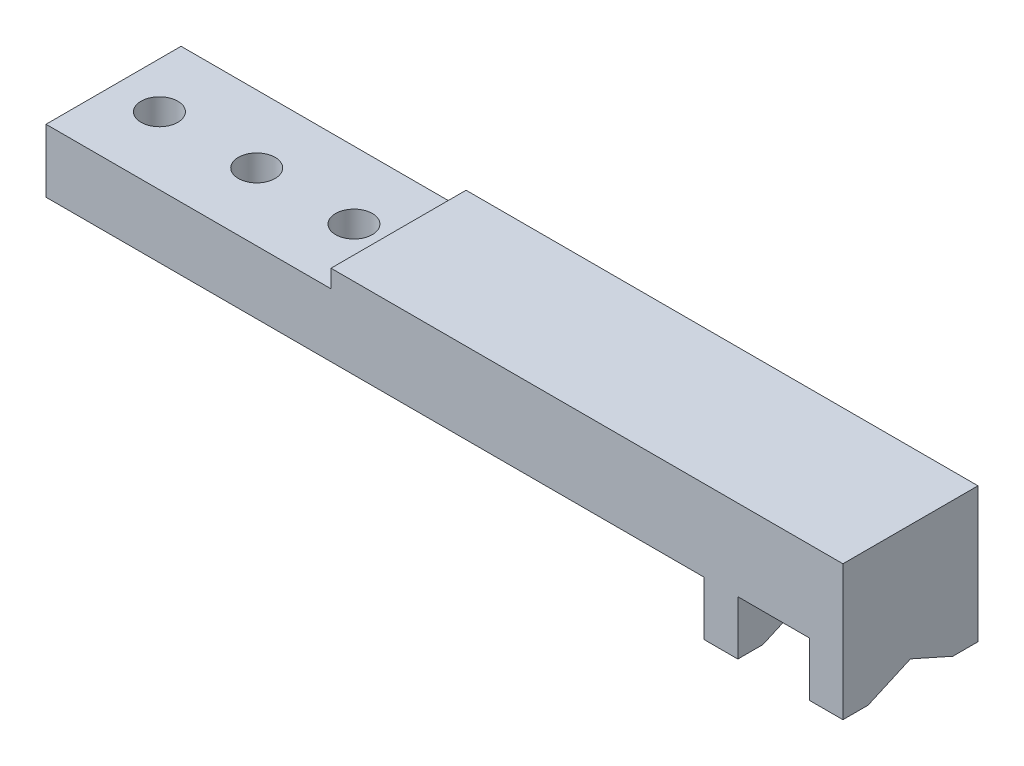
ISO-10303-21;
HEADER;
FILE_DESCRIPTION(('STEP AP214'),'2;1');
FILE_NAME('part.step','',(''),(''),'','','');
FILE_SCHEMA(('AUTOMOTIVE_DESIGN { 1 0 10303 214 1 1 1 1 }'));
ENDSEC;
DATA;
#1=APPLICATION_CONTEXT('core data for automotive mechanical design processes');
#2=APPLICATION_PROTOCOL_DEFINITION('international standard','automotive_design',2000,#1);
#3=PRODUCT_CONTEXT('',#1,'mechanical');
#4=PRODUCT('Part','Part','',(#3));
#5=PRODUCT_RELATED_PRODUCT_CATEGORY('part','',(#4));
#6=PRODUCT_DEFINITION_FORMATION('','',#4);
#7=PRODUCT_DEFINITION_CONTEXT('part definition',#1,'design');
#8=PRODUCT_DEFINITION('design','',#6,#7);
#9=PRODUCT_DEFINITION_SHAPE('','',#8);
#10=(LENGTH_UNIT() NAMED_UNIT(*) SI_UNIT(.MILLI.,.METRE.));
#11=(NAMED_UNIT(*) PLANE_ANGLE_UNIT() SI_UNIT($,.RADIAN.));
#12=(NAMED_UNIT(*) SI_UNIT($,.STERADIAN.) SOLID_ANGLE_UNIT());
#13=UNCERTAINTY_MEASURE_WITH_UNIT(LENGTH_MEASURE(1.E-05),#10,'distance_accuracy_value','');
#14=(GEOMETRIC_REPRESENTATION_CONTEXT(3) GLOBAL_UNCERTAINTY_ASSIGNED_CONTEXT((#13)) GLOBAL_UNIT_ASSIGNED_CONTEXT((#10,
#11,#12)) REPRESENTATION_CONTEXT('',''));
#15=CARTESIAN_POINT('',(0.,0.,0.));
#16=DIRECTION('',(0.,0.,1.));
#17=DIRECTION('',(1.,0.,0.));
#18=AXIS2_PLACEMENT_3D('',#15,#16,#17);
#19=CARTESIAN_POINT('',(0.,0.,0.));
#20=DIRECTION('',(0.,-1.,0.));
#21=DIRECTION('',(0.,0.,-1.));
#22=AXIS2_PLACEMENT_3D('',#19,#20,#21);
#23=PLANE('',#22);
#24=DIRECTION('',(1.,0.,0.));
#25=VECTOR('',#24,1.);
#26=CARTESIAN_POINT('',(0.,0.,10.3378));
#27=LINE('',#26,#25);
#28=CARTESIAN_POINT('',(61.8744,0.,10.3378));
#29=VERTEX_POINT('',#28);
#30=CARTESIAN_POINT('',(65.0494,0.,10.3378));
#31=VERTEX_POINT('',#30);
#32=EDGE_CURVE('E318',#29,#31,#27,.T.);
#33=ORIENTED_EDGE('',*,*,#32,.T.);
#34=DIRECTION('',(0.,0.,1.));
#35=VECTOR('',#34,1.);
#36=CARTESIAN_POINT('',(65.0494,0.,0.));
#37=LINE('',#36,#35);
#38=CARTESIAN_POINT('',(65.0494,0.,12.7));
#39=VERTEX_POINT('',#38);
#40=EDGE_CURVE('E221',#31,#39,#37,.T.);
#41=ORIENTED_EDGE('',*,*,#40,.T.);
#42=DIRECTION('',(1.,0.,0.));
#43=VECTOR('',#42,1.);
#44=CARTESIAN_POINT('',(0.,0.,12.7));
#45=LINE('',#44,#43);
#46=CARTESIAN_POINT('',(61.8744,0.,12.7));
#47=VERTEX_POINT('',#46);
#48=EDGE_CURVE('E189',#47,#39,#45,.T.);
#49=ORIENTED_EDGE('',*,*,#48,.F.);
#50=DIRECTION('',(0.,0.,1.));
#51=VECTOR('',#50,1.);
#52=CARTESIAN_POINT('',(61.8744,0.,0.));
#53=LINE('',#52,#51);
#54=EDGE_CURVE('E254',#29,#47,#53,.T.);
#55=ORIENTED_EDGE('',*,*,#54,.F.);
#56=EDGE_LOOP('',(#33,#41,#49,#55));
#57=FACE_BOUND('',#56,.T.);
#58=ADVANCED_FACE('F42',(#57),#23,.T.);
#59=CARTESIAN_POINT('',(71.7804,0.,10.3378));
#60=VERTEX_POINT('',#59);
#61=CARTESIAN_POINT('',(74.93,0.,10.3378));
#62=VERTEX_POINT('',#61);
#63=EDGE_CURVE('E316',#60,#62,#27,.T.);
#64=ORIENTED_EDGE('',*,*,#63,.T.);
#65=DIRECTION('',(0.,0.,-1.));
#66=VECTOR('',#65,1.);
#67=CARTESIAN_POINT('',(74.93,0.,12.7));
#68=LINE('',#67,#66);
#69=CARTESIAN_POINT('',(74.93,0.,12.7));
#70=VERTEX_POINT('',#69);
#71=EDGE_CURVE('E188',#70,#62,#68,.T.);
#72=ORIENTED_EDGE('',*,*,#71,.F.);
#73=CARTESIAN_POINT('',(71.7804,0.,12.7));
#74=VERTEX_POINT('',#73);
#75=EDGE_CURVE('E193',#74,#70,#45,.T.);
#76=ORIENTED_EDGE('',*,*,#75,.F.);
#77=DIRECTION('',(0.,0.,1.));
#78=VECTOR('',#77,1.);
#79=CARTESIAN_POINT('',(71.7804,0.,0.));
#80=LINE('',#79,#78);
#81=EDGE_CURVE('E222',#60,#74,#80,.T.);
#82=ORIENTED_EDGE('',*,*,#81,.F.);
#83=EDGE_LOOP('',(#64,#72,#76,#82));
#84=FACE_BOUND('',#83,.T.);
#85=ADVANCED_FACE('F315',(#84),#23,.T.);
#86=DIRECTION('',(1.,0.,0.));
#87=VECTOR('',#86,1.);
#88=CARTESIAN_POINT('',(0.,0.,2.36219999999999));
#89=LINE('',#88,#87);
#90=CARTESIAN_POINT('',(61.8744,0.,2.36219999999999));
#91=VERTEX_POINT('',#90);
#92=CARTESIAN_POINT('',(65.0494,0.,2.36219999999999));
#93=VERTEX_POINT('',#92);
#94=EDGE_CURVE('E57',#91,#93,#89,.T.);
#95=ORIENTED_EDGE('',*,*,#94,.F.);
#96=CARTESIAN_POINT('',(61.8744,0.,0.));
#97=VERTEX_POINT('',#96);
#98=EDGE_CURVE('E250',#97,#91,#53,.T.);
#99=ORIENTED_EDGE('',*,*,#98,.F.);
#100=DIRECTION('',(-1.,0.,0.));
#101=VECTOR('',#100,1.);
#102=CARTESIAN_POINT('',(0.,0.,0.));
#103=LINE('',#102,#101);
#104=CARTESIAN_POINT('',(65.0494,0.,0.));
#105=VERTEX_POINT('',#104);
#106=EDGE_CURVE('E191',#105,#97,#103,.T.);
#107=ORIENTED_EDGE('',*,*,#106,.F.);
#108=EDGE_CURVE('E224',#105,#93,#37,.T.);
#109=ORIENTED_EDGE('',*,*,#108,.T.);
#110=EDGE_LOOP('',(#95,#99,#107,#109));
#111=FACE_BOUND('',#110,.T.);
#112=ADVANCED_FACE('F371',(#111),#23,.T.);
#113=CARTESIAN_POINT('',(0.,12.7,12.7));
#114=DIRECTION('',(1.,0.,0.));
#115=DIRECTION('',(0.,0.,-1.));
#116=AXIS2_PLACEMENT_3D('',#113,#114,#115);
#117=PLANE('',#116);
#118=DIRECTION('',(0.,-1.,0.));
#119=VECTOR('',#118,1.);
#120=CARTESIAN_POINT('',(0.,12.7,12.7));
#121=LINE('',#120,#119);
#122=CARTESIAN_POINT('',(0.,11.0236,12.7));
#123=VERTEX_POINT('',#122);
#124=CARTESIAN_POINT('',(0.,5.08,12.7));
#125=VERTEX_POINT('',#124);
#126=EDGE_CURVE('E208',#123,#125,#121,.T.);
#127=ORIENTED_EDGE('',*,*,#126,.F.);
#128=DIRECTION('',(0.,0.,1.));
#129=VECTOR('',#128,1.);
#130=CARTESIAN_POINT('',(0.,11.0236,0.));
#131=LINE('',#130,#129);
#132=CARTESIAN_POINT('',(0.,11.0236,0.));
#133=VERTEX_POINT('',#132);
#134=EDGE_CURVE('E289',#133,#123,#131,.T.);
#135=ORIENTED_EDGE('',*,*,#134,.F.);
#136=DIRECTION('',(0.,-1.,0.));
#137=VECTOR('',#136,1.);
#138=CARTESIAN_POINT('',(0.,12.7,0.));
#139=LINE('',#138,#137);
#140=CARTESIAN_POINT('',(0.,5.08,0.));
#141=VERTEX_POINT('',#140);
#142=EDGE_CURVE('E199',#133,#141,#139,.T.);
#143=ORIENTED_EDGE('',*,*,#142,.T.);
#144=DIRECTION('',(0.,0.,1.));
#145=VECTOR('',#144,1.);
#146=CARTESIAN_POINT('',(0.,5.08,0.));
#147=LINE('',#146,#145);
#148=EDGE_CURVE('E257',#141,#125,#147,.T.);
#149=ORIENTED_EDGE('',*,*,#148,.T.);
#150=EDGE_LOOP('',(#127,#135,#143,#149));
#151=FACE_BOUND('',#150,.T.);
#152=ADVANCED_FACE('F44',(#151),#117,.F.);
#153=CARTESIAN_POINT('',(0.,12.7,12.7));
#154=DIRECTION('',(0.,0.,-1.));
#155=DIRECTION('',(-1.,0.,0.));
#156=AXIS2_PLACEMENT_3D('',#153,#154,#155);
#157=PLANE('',#156);
#158=DIRECTION('',(1.,0.,0.));
#159=VECTOR('',#158,1.);
#160=CARTESIAN_POINT('',(0.,12.7,12.7));
#161=LINE('',#160,#159);
#162=CARTESIAN_POINT('',(26.797,12.7,12.7));
#163=VERTEX_POINT('',#162);
#164=CARTESIAN_POINT('',(74.93,12.7,12.7));
#165=VERTEX_POINT('',#164);
#166=EDGE_CURVE('E198',#163,#165,#161,.T.);
#167=ORIENTED_EDGE('',*,*,#166,.F.);
#168=DIRECTION('',(0.,1.,0.));
#169=VECTOR('',#168,1.);
#170=CARTESIAN_POINT('',(26.797,12.7,12.7));
#171=LINE('',#170,#169);
#172=CARTESIAN_POINT('',(26.797,11.0236,12.7));
#173=VERTEX_POINT('',#172);
#174=EDGE_CURVE('E292',#173,#163,#171,.T.);
#175=ORIENTED_EDGE('',*,*,#174,.F.);
#176=DIRECTION('',(1.,0.,0.));
#177=VECTOR('',#176,1.);
#178=CARTESIAN_POINT('',(0.,11.0236,12.7));
#179=LINE('',#178,#177);
#180=EDGE_CURVE('E243',#123,#173,#179,.T.);
#181=ORIENTED_EDGE('',*,*,#180,.F.);
#182=ORIENTED_EDGE('',*,*,#126,.T.);
#183=DIRECTION('',(-1.,0.,0.));
#184=VECTOR('',#183,1.);
#185=CARTESIAN_POINT('',(0.,5.08,12.7));
#186=LINE('',#185,#184);
#187=CARTESIAN_POINT('',(61.8744,5.08000000000001,12.7));
#188=VERTEX_POINT('',#187);
#189=EDGE_CURVE('E261',#188,#125,#186,.T.);
#190=ORIENTED_EDGE('',*,*,#189,.F.);
#191=DIRECTION('',(0.,1.,0.));
#192=VECTOR('',#191,1.);
#193=CARTESIAN_POINT('',(61.8744,0.,12.7));
#194=LINE('',#193,#192);
#195=EDGE_CURVE('E232',#47,#188,#194,.T.);
#196=ORIENTED_EDGE('',*,*,#195,.F.);
#197=ORIENTED_EDGE('',*,*,#48,.T.);
#198=DIRECTION('',(0.,-1.,0.));
#199=VECTOR('',#198,1.);
#200=CARTESIAN_POINT('',(65.0494,0.,12.7));
#201=LINE('',#200,#199);
#202=CARTESIAN_POINT('',(65.0494,5.08,12.7));
#203=VERTEX_POINT('',#202);
#204=EDGE_CURVE('E240',#203,#39,#201,.T.);
#205=ORIENTED_EDGE('',*,*,#204,.F.);
#206=DIRECTION('',(-1.,0.,0.));
#207=VECTOR('',#206,1.);
#208=CARTESIAN_POINT('',(65.0494,5.08,12.7));
#209=LINE('',#208,#207);
#210=CARTESIAN_POINT('',(71.7804,5.08,12.7));
#211=VERTEX_POINT('',#210);
#212=EDGE_CURVE('E233',#211,#203,#209,.T.);
#213=ORIENTED_EDGE('',*,*,#212,.F.);
#214=DIRECTION('',(0.,1.,0.));
#215=VECTOR('',#214,1.);
#216=CARTESIAN_POINT('',(71.7804,0.,12.7));
#217=LINE('',#216,#215);
#218=EDGE_CURVE('E236',#74,#211,#217,.T.);
#219=ORIENTED_EDGE('',*,*,#218,.F.);
#220=ORIENTED_EDGE('',*,*,#75,.T.);
#221=DIRECTION('',(0.,-1.,0.));
#222=VECTOR('',#221,1.);
#223=CARTESIAN_POINT('',(74.93,12.7,12.7));
#224=LINE('',#223,#222);
#225=EDGE_CURVE('E205',#165,#70,#224,.T.);
#226=ORIENTED_EDGE('',*,*,#225,.F.);
#227=EDGE_LOOP('',(#167,#175,#181,#182,#190,#196,#197,#205,#213,#219,#220,#226));
#228=FACE_BOUND('',#227,.T.);
#229=ADVANCED_FACE('F308',(#228),#157,.F.);
#230=CARTESIAN_POINT('',(74.93,12.7,12.7));
#231=DIRECTION('',(-1.,0.,0.));
#232=DIRECTION('',(0.,0.,1.));
#233=AXIS2_PLACEMENT_3D('',#230,#231,#232);
#234=PLANE('',#233);
#235=ORIENTED_EDGE('',*,*,#71,.T.);
#236=DIRECTION('',(0.,-0.407217699388902,0.913331125772252));
#237=VECTOR('',#236,1.);
#238=CARTESIAN_POINT('',(74.93,0.,10.3378));
#239=LINE('',#238,#237);
#240=CARTESIAN_POINT('',(74.93,1.778,6.34999999999999));
#241=VERTEX_POINT('',#240);
#242=EDGE_CURVE('E175',#241,#62,#239,.T.);
#243=ORIENTED_EDGE('',*,*,#242,.F.);
#244=DIRECTION('',(0.,0.407217699388902,0.913331125772252));
#245=VECTOR('',#244,1.);
#246=CARTESIAN_POINT('',(74.93,1.778,6.34999999999999));
#247=LINE('',#246,#245);
#248=CARTESIAN_POINT('',(74.93,0.,2.36219999999999));
#249=VERTEX_POINT('',#248);
#250=EDGE_CURVE('E168',#249,#241,#247,.T.);
#251=ORIENTED_EDGE('',*,*,#250,.F.);
#252=CARTESIAN_POINT('',(74.93,0.,0.));
#253=VERTEX_POINT('',#252);
#254=EDGE_CURVE('E181',#249,#253,#68,.T.);
#255=ORIENTED_EDGE('',*,*,#254,.T.);
#256=DIRECTION('',(0.,-1.,0.));
#257=VECTOR('',#256,1.);
#258=CARTESIAN_POINT('',(74.93,12.7,0.));
#259=LINE('',#258,#257);
#260=CARTESIAN_POINT('',(74.93,12.7,0.));
#261=VERTEX_POINT('',#260);
#262=EDGE_CURVE('E202',#261,#253,#259,.T.);
#263=ORIENTED_EDGE('',*,*,#262,.F.);
#264=DIRECTION('',(0.,0.,-1.));
#265=VECTOR('',#264,1.);
#266=CARTESIAN_POINT('',(74.93,12.7,12.7));
#267=LINE('',#266,#265);
#268=EDGE_CURVE('E271',#165,#261,#267,.T.);
#269=ORIENTED_EDGE('',*,*,#268,.F.);
#270=ORIENTED_EDGE('',*,*,#225,.T.);
#271=EDGE_LOOP('',(#235,#243,#251,#255,#263,#269,#270));
#272=FACE_BOUND('',#271,.T.);
#273=ADVANCED_FACE('F179',(#272),#234,.F.);
#274=CARTESIAN_POINT('',(0.,12.7,0.));
#275=DIRECTION('',(0.,0.,1.));
#276=DIRECTION('',(1.,0.,0.));
#277=AXIS2_PLACEMENT_3D('',#274,#275,#276);
#278=PLANE('',#277);
#279=DIRECTION('',(1.,0.,0.));
#280=VECTOR('',#279,1.);
#281=CARTESIAN_POINT('',(0.,11.0236,0.));
#282=LINE('',#281,#280);
#283=CARTESIAN_POINT('',(26.797,11.0236,0.));
#284=VERTEX_POINT('',#283);
#285=EDGE_CURVE('E287',#133,#284,#282,.T.);
#286=ORIENTED_EDGE('',*,*,#285,.T.);
#287=DIRECTION('',(0.,1.,0.));
#288=VECTOR('',#287,1.);
#289=CARTESIAN_POINT('',(26.797,12.7,0.));
#290=LINE('',#289,#288);
#291=CARTESIAN_POINT('',(26.797,12.7,0.));
#292=VERTEX_POINT('',#291);
#293=EDGE_CURVE('E285',#284,#292,#290,.T.);
#294=ORIENTED_EDGE('',*,*,#293,.T.);
#295=DIRECTION('',(-1.,0.,0.));
#296=VECTOR('',#295,1.);
#297=CARTESIAN_POINT('',(0.,12.7,0.));
#298=LINE('',#297,#296);
#299=EDGE_CURVE('E203',#261,#292,#298,.T.);
#300=ORIENTED_EDGE('',*,*,#299,.F.);
#301=ORIENTED_EDGE('',*,*,#262,.T.);
#302=CARTESIAN_POINT('',(71.7804,0.,0.));
#303=VERTEX_POINT('',#302);
#304=EDGE_CURVE('E187',#253,#303,#103,.T.);
#305=ORIENTED_EDGE('',*,*,#304,.T.);
#306=DIRECTION('',(0.,1.,0.));
#307=VECTOR('',#306,1.);
#308=CARTESIAN_POINT('',(71.7804,0.,0.));
#309=LINE('',#308,#307);
#310=CARTESIAN_POINT('',(71.7804,5.08,0.));
#311=VERTEX_POINT('',#310);
#312=EDGE_CURVE('E220',#303,#311,#309,.T.);
#313=ORIENTED_EDGE('',*,*,#312,.T.);
#314=DIRECTION('',(-1.,0.,0.));
#315=VECTOR('',#314,1.);
#316=CARTESIAN_POINT('',(65.0494,5.08,0.));
#317=LINE('',#316,#315);
#318=CARTESIAN_POINT('',(65.0494,5.08,0.));
#319=VERTEX_POINT('',#318);
#320=EDGE_CURVE('E244',#311,#319,#317,.T.);
#321=ORIENTED_EDGE('',*,*,#320,.T.);
#322=DIRECTION('',(0.,-1.,0.));
#323=VECTOR('',#322,1.);
#324=CARTESIAN_POINT('',(65.0494,0.,0.));
#325=LINE('',#324,#323);
#326=EDGE_CURVE('E237',#319,#105,#325,.T.);
#327=ORIENTED_EDGE('',*,*,#326,.T.);
#328=ORIENTED_EDGE('',*,*,#106,.T.);
#329=DIRECTION('',(0.,1.,0.));
#330=VECTOR('',#329,1.);
#331=CARTESIAN_POINT('',(61.8744,0.,0.));
#332=LINE('',#331,#330);
#333=CARTESIAN_POINT('',(61.8744,5.08000000000001,0.));
#334=VERTEX_POINT('',#333);
#335=EDGE_CURVE('E263',#97,#334,#332,.T.);
#336=ORIENTED_EDGE('',*,*,#335,.T.);
#337=DIRECTION('',(-1.,0.,0.));
#338=VECTOR('',#337,1.);
#339=CARTESIAN_POINT('',(0.,5.08,0.));
#340=LINE('',#339,#338);
#341=EDGE_CURVE('E253',#334,#141,#340,.T.);
#342=ORIENTED_EDGE('',*,*,#341,.T.);
#343=ORIENTED_EDGE('',*,*,#142,.F.);
#344=EDGE_LOOP('',(#286,#294,#300,#301,#305,#313,#321,#327,#328,#336,#342,#343));
#345=FACE_BOUND('',#344,.T.);
#346=ADVANCED_FACE('F283',(#345),#278,.F.);
#347=CARTESIAN_POINT('',(0.,12.7,0.));
#348=DIRECTION('',(0.,-1.,0.));
#349=DIRECTION('',(0.,0.,-1.));
#350=AXIS2_PLACEMENT_3D('',#347,#348,#349);
#351=PLANE('',#350);
#352=ORIENTED_EDGE('',*,*,#299,.T.);
#353=DIRECTION('',(0.,0.,1.));
#354=VECTOR('',#353,1.);
#355=CARTESIAN_POINT('',(26.797,12.7,0.));
#356=LINE('',#355,#354);
#357=EDGE_CURVE('E277',#292,#163,#356,.T.);
#358=ORIENTED_EDGE('',*,*,#357,.T.);
#359=ORIENTED_EDGE('',*,*,#166,.T.);
#360=ORIENTED_EDGE('',*,*,#268,.T.);
#361=EDGE_LOOP('',(#352,#358,#359,#360));
#362=FACE_BOUND('',#361,.T.);
#363=ADVANCED_FACE('F276',(#362),#351,.F.);
#364=CARTESIAN_POINT('',(71.7804,0.,2.36219999999999));
#365=VERTEX_POINT('',#364);
#366=EDGE_CURVE('E165',#365,#249,#89,.T.);
#367=ORIENTED_EDGE('',*,*,#366,.F.);
#368=EDGE_CURVE('E218',#303,#365,#80,.T.);
#369=ORIENTED_EDGE('',*,*,#368,.F.);
#370=ORIENTED_EDGE('',*,*,#304,.F.);
#371=ORIENTED_EDGE('',*,*,#254,.F.);
#372=EDGE_LOOP('',(#367,#369,#370,#371));
#373=FACE_BOUND('',#372,.T.);
#374=ADVANCED_FACE('F185',(#373),#23,.T.);
#375=CARTESIAN_POINT('',(0.,5.08,0.));
#376=DIRECTION('',(0.,1.,0.));
#377=DIRECTION('',(-1.,0.,0.));
#378=AXIS2_PLACEMENT_3D('',#375,#376,#377);
#379=PLANE('',#378);
#380=CARTESIAN_POINT('',(4.318,5.08,6.35));
#381=DIRECTION('',(0.,-1.,0.));
#382=DIRECTION('',(0.,0.,-1.));
#383=AXIS2_PLACEMENT_3D('',#380,#381,#382);
#384=CIRCLE('',#383,1.7272);
#385=CARTESIAN_POINT('',(4.318,5.08,4.6228));
#386=VERTEX_POINT('',#385);
#387=EDGE_CURVE('E214',#386,#386,#384,.T.);
#388=ORIENTED_EDGE('',*,*,#387,.F.);
#389=EDGE_LOOP('',(#388));
#390=FACE_BOUND('',#389,.T.);
#391=CARTESIAN_POINT('',(13.462,5.08,6.35));
#392=DIRECTION('',(0.,-1.,0.));
#393=DIRECTION('',(0.,0.,-1.));
#394=AXIS2_PLACEMENT_3D('',#391,#392,#393);
#395=CIRCLE('',#394,1.7272);
#396=CARTESIAN_POINT('',(13.462,5.08,4.6228));
#397=VERTEX_POINT('',#396);
#398=EDGE_CURVE('E213',#397,#397,#395,.T.);
#399=ORIENTED_EDGE('',*,*,#398,.F.);
#400=EDGE_LOOP('',(#399));
#401=FACE_BOUND('',#400,.T.);
#402=CARTESIAN_POINT('',(22.606,5.08,6.35));
#403=DIRECTION('',(0.,-1.,0.));
#404=DIRECTION('',(0.,0.,-1.));
#405=AXIS2_PLACEMENT_3D('',#402,#403,#404);
#406=CIRCLE('',#405,1.7272);
#407=CARTESIAN_POINT('',(22.606,5.08,4.62280000000001));
#408=VERTEX_POINT('',#407);
#409=EDGE_CURVE('E344',#408,#408,#406,.T.);
#410=ORIENTED_EDGE('',*,*,#409,.F.);
#411=EDGE_LOOP('',(#410));
#412=FACE_BOUND('',#411,.T.);
#413=ORIENTED_EDGE('',*,*,#189,.T.);
#414=ORIENTED_EDGE('',*,*,#148,.F.);
#415=ORIENTED_EDGE('',*,*,#341,.F.);
#416=DIRECTION('',(0.,0.,1.));
#417=VECTOR('',#416,1.);
#418=CARTESIAN_POINT('',(61.8744,5.08000000000001,0.));
#419=LINE('',#418,#417);
#420=EDGE_CURVE('E255',#334,#188,#419,.T.);
#421=ORIENTED_EDGE('',*,*,#420,.T.);
#422=EDGE_LOOP('',(#413,#414,#415,#421));
#423=FACE_BOUND('',#422,.T.);
#424=ADVANCED_FACE('F375',(#390,#401,#412,#423),#379,.F.);
#425=CARTESIAN_POINT('',(61.8744,0.,0.));
#426=DIRECTION('',(1.,0.,0.));
#427=DIRECTION('',(0.,0.,-1.));
#428=AXIS2_PLACEMENT_3D('',#425,#426,#427);
#429=PLANE('',#428);
#430=DIRECTION('',(0.,0.407217699388902,0.913331125772252));
#431=VECTOR('',#430,1.);
#432=CARTESIAN_POINT('',(61.8744,-0.878560289688321,0.391714778841899));
#433=LINE('',#432,#431);
#434=CARTESIAN_POINT('',(61.8744,1.778,6.34999999999999));
#435=VERTEX_POINT('',#434);
#436=EDGE_CURVE('E328',#91,#435,#433,.T.);
#437=ORIENTED_EDGE('',*,*,#436,.T.);
#438=DIRECTION('',(0.,-0.407217699388902,0.913331125772252));
#439=VECTOR('',#438,1.);
#440=CARTESIAN_POINT('',(61.8744,3.8448821279908,1.71427865579205));
#441=LINE('',#440,#439);
#442=EDGE_CURVE('E334',#435,#29,#441,.T.);
#443=ORIENTED_EDGE('',*,*,#442,.T.);
#444=ORIENTED_EDGE('',*,*,#54,.T.);
#445=ORIENTED_EDGE('',*,*,#195,.T.);
#446=ORIENTED_EDGE('',*,*,#420,.F.);
#447=ORIENTED_EDGE('',*,*,#335,.F.);
#448=ORIENTED_EDGE('',*,*,#98,.T.);
#449=EDGE_LOOP('',(#437,#443,#444,#445,#446,#447,#448));
#450=FACE_BOUND('',#449,.T.);
#451=ADVANCED_FACE('F380',(#450),#429,.F.);
#452=CARTESIAN_POINT('',(65.0494,0.,0.));
#453=DIRECTION('',(-1.,0.,0.));
#454=DIRECTION('',(0.,0.,1.));
#455=AXIS2_PLACEMENT_3D('',#452,#453,#454);
#456=PLANE('',#455);
#457=ORIENTED_EDGE('',*,*,#40,.F.);
#458=DIRECTION('',(0.,0.407217699388902,-0.913331125772252));
#459=VECTOR('',#458,1.);
#460=CARTESIAN_POINT('',(65.0494,3.8448821279908,1.71427865579205));
#461=LINE('',#460,#459);
#462=CARTESIAN_POINT('',(65.0494,1.778,6.34999999999999));
#463=VERTEX_POINT('',#462);
#464=EDGE_CURVE('E331',#31,#463,#461,.T.);
#465=ORIENTED_EDGE('',*,*,#464,.T.);
#466=DIRECTION('',(0.,-0.407217699388902,-0.913331125772252));
#467=VECTOR('',#466,1.);
#468=CARTESIAN_POINT('',(65.0494,-0.87856028968832,0.391714778841901));
#469=LINE('',#468,#467);
#470=EDGE_CURVE('E322',#463,#93,#469,.T.);
#471=ORIENTED_EDGE('',*,*,#470,.T.);
#472=ORIENTED_EDGE('',*,*,#108,.F.);
#473=ORIENTED_EDGE('',*,*,#326,.F.);
#474=DIRECTION('',(0.,0.,1.));
#475=VECTOR('',#474,1.);
#476=CARTESIAN_POINT('',(65.0494,5.08,0.));
#477=LINE('',#476,#475);
#478=EDGE_CURVE('E230',#319,#203,#477,.T.);
#479=ORIENTED_EDGE('',*,*,#478,.T.);
#480=ORIENTED_EDGE('',*,*,#204,.T.);
#481=EDGE_LOOP('',(#457,#465,#471,#472,#473,#479,#480));
#482=FACE_BOUND('',#481,.T.);
#483=ADVANCED_FACE('F399',(#482),#456,.F.);
#484=CARTESIAN_POINT('',(65.0494,5.08,0.));
#485=DIRECTION('',(0.,1.,0.));
#486=DIRECTION('',(0.,0.,1.));
#487=AXIS2_PLACEMENT_3D('',#484,#485,#486);
#488=PLANE('',#487);
#489=ORIENTED_EDGE('',*,*,#212,.T.);
#490=ORIENTED_EDGE('',*,*,#478,.F.);
#491=ORIENTED_EDGE('',*,*,#320,.F.);
#492=DIRECTION('',(0.,0.,1.));
#493=VECTOR('',#492,1.);
#494=CARTESIAN_POINT('',(71.7804,5.08,0.));
#495=LINE('',#494,#493);
#496=EDGE_CURVE('E226',#311,#211,#495,.T.);
#497=ORIENTED_EDGE('',*,*,#496,.T.);
#498=EDGE_LOOP('',(#489,#490,#491,#497));
#499=FACE_BOUND('',#498,.T.);
#500=ADVANCED_FACE('F412',(#499),#488,.F.);
#501=CARTESIAN_POINT('',(71.7804,0.,0.));
#502=DIRECTION('',(1.,0.,0.));
#503=DIRECTION('',(0.,0.,-1.));
#504=AXIS2_PLACEMENT_3D('',#501,#502,#503);
#505=PLANE('',#504);
#506=DIRECTION('',(0.,0.407217699388902,0.913331125772252));
#507=VECTOR('',#506,1.);
#508=CARTESIAN_POINT('',(71.7804,-0.87856028968832,0.391714778841902));
#509=LINE('',#508,#507);
#510=CARTESIAN_POINT('',(71.7804,1.778,6.34999999999999));
#511=VERTEX_POINT('',#510);
#512=EDGE_CURVE('E50',#365,#511,#509,.T.);
#513=ORIENTED_EDGE('',*,*,#512,.T.);
#514=DIRECTION('',(0.,-0.407217699388902,0.913331125772252));
#515=VECTOR('',#514,1.);
#516=CARTESIAN_POINT('',(71.7804,3.8448821279908,1.71427865579205));
#517=LINE('',#516,#515);
#518=EDGE_CURVE('E11',#511,#60,#517,.T.);
#519=ORIENTED_EDGE('',*,*,#518,.T.);
#520=ORIENTED_EDGE('',*,*,#81,.T.);
#521=ORIENTED_EDGE('',*,*,#218,.T.);
#522=ORIENTED_EDGE('',*,*,#496,.F.);
#523=ORIENTED_EDGE('',*,*,#312,.F.);
#524=ORIENTED_EDGE('',*,*,#368,.T.);
#525=EDGE_LOOP('',(#513,#519,#520,#521,#522,#523,#524));
#526=FACE_BOUND('',#525,.T.);
#527=ADVANCED_FACE('F216',(#526),#505,.F.);
#528=CARTESIAN_POINT('',(26.797,12.7,0.));
#529=DIRECTION('',(1.,0.,0.));
#530=DIRECTION('',(0.,0.,-1.));
#531=AXIS2_PLACEMENT_3D('',#528,#529,#530);
#532=PLANE('',#531);
#533=ORIENTED_EDGE('',*,*,#174,.T.);
#534=ORIENTED_EDGE('',*,*,#357,.F.);
#535=ORIENTED_EDGE('',*,*,#293,.F.);
#536=DIRECTION('',(0.,0.,1.));
#537=VECTOR('',#536,1.);
#538=CARTESIAN_POINT('',(26.797,11.0236,0.));
#539=LINE('',#538,#537);
#540=EDGE_CURVE('E291',#284,#173,#539,.T.);
#541=ORIENTED_EDGE('',*,*,#540,.T.);
#542=EDGE_LOOP('',(#533,#534,#535,#541));
#543=FACE_BOUND('',#542,.T.);
#544=ADVANCED_FACE('F300',(#543),#532,.F.);
#545=CARTESIAN_POINT('',(0.,11.0236,0.));
#546=DIRECTION('',(0.,-1.,0.));
#547=DIRECTION('',(0.,0.,-1.));
#548=AXIS2_PLACEMENT_3D('',#545,#546,#547);
#549=PLANE('',#548);
#550=CARTESIAN_POINT('',(4.318,11.0236,6.35));
#551=DIRECTION('',(0.,-1.,0.));
#552=DIRECTION('',(0.,0.,-1.));
#553=AXIS2_PLACEMENT_3D('',#550,#551,#552);
#554=CIRCLE('',#553,1.7272);
#555=CARTESIAN_POINT('',(4.318,11.0236,4.62280000000001));
#556=VERTEX_POINT('',#555);
#557=EDGE_CURVE('E211',#556,#556,#554,.T.);
#558=ORIENTED_EDGE('',*,*,#557,.T.);
#559=EDGE_LOOP('',(#558));
#560=FACE_BOUND('',#559,.T.);
#561=CARTESIAN_POINT('',(13.462,11.0236,6.35));
#562=DIRECTION('',(0.,-1.,0.));
#563=DIRECTION('',(0.,0.,-1.));
#564=AXIS2_PLACEMENT_3D('',#561,#562,#563);
#565=CIRCLE('',#564,1.7272);
#566=CARTESIAN_POINT('',(13.462,11.0236,4.6228));
#567=VERTEX_POINT('',#566);
#568=EDGE_CURVE('E341',#567,#567,#565,.T.);
#569=ORIENTED_EDGE('',*,*,#568,.T.);
#570=EDGE_LOOP('',(#569));
#571=FACE_BOUND('',#570,.T.);
#572=CARTESIAN_POINT('',(22.606,11.0236,6.35));
#573=DIRECTION('',(0.,-1.,0.));
#574=DIRECTION('',(0.,0.,-1.));
#575=AXIS2_PLACEMENT_3D('',#572,#573,#574);
#576=CIRCLE('',#575,1.7272);
#577=CARTESIAN_POINT('',(22.606,11.0236,4.62280000000001));
#578=VERTEX_POINT('',#577);
#579=EDGE_CURVE('E260',#578,#578,#576,.T.);
#580=ORIENTED_EDGE('',*,*,#579,.T.);
#581=EDGE_LOOP('',(#580));
#582=FACE_BOUND('',#581,.T.);
#583=ORIENTED_EDGE('',*,*,#180,.T.);
#584=ORIENTED_EDGE('',*,*,#540,.F.);
#585=ORIENTED_EDGE('',*,*,#285,.F.);
#586=ORIENTED_EDGE('',*,*,#134,.T.);
#587=EDGE_LOOP('',(#583,#584,#585,#586));
#588=FACE_BOUND('',#587,.T.);
#589=ADVANCED_FACE('F304',(#560,#571,#582,#588),#549,.F.);
#590=CARTESIAN_POINT('',(22.606,5.08,6.35));
#591=DIRECTION('',(0.,-1.,0.));
#592=DIRECTION('',(0.,0.,-1.));
#593=AXIS2_PLACEMENT_3D('',#590,#591,#592);
#594=CYLINDRICAL_SURFACE('',#593,1.7272);
#595=ORIENTED_EDGE('',*,*,#409,.T.);
#596=EDGE_LOOP('',(#595));
#597=FACE_BOUND('',#596,.T.);
#598=ORIENTED_EDGE('',*,*,#579,.F.);
#599=EDGE_LOOP('',(#598));
#600=FACE_BOUND('',#599,.T.);
#601=ADVANCED_FACE('F350',(#597,#600),#594,.F.);
#602=CARTESIAN_POINT('',(13.462,5.08,6.35));
#603=DIRECTION('',(0.,-1.,0.));
#604=DIRECTION('',(0.,0.,-1.));
#605=AXIS2_PLACEMENT_3D('',#602,#603,#604);
#606=CYLINDRICAL_SURFACE('',#605,1.7272);
#607=ORIENTED_EDGE('',*,*,#398,.T.);
#608=EDGE_LOOP('',(#607));
#609=FACE_BOUND('',#608,.T.);
#610=ORIENTED_EDGE('',*,*,#568,.F.);
#611=EDGE_LOOP('',(#610));
#612=FACE_BOUND('',#611,.T.);
#613=ADVANCED_FACE('F352',(#609,#612),#606,.F.);
#614=CARTESIAN_POINT('',(4.318,5.08,6.35));
#615=DIRECTION('',(0.,-1.,0.));
#616=DIRECTION('',(0.,0.,-1.));
#617=AXIS2_PLACEMENT_3D('',#614,#615,#616);
#618=CYLINDRICAL_SURFACE('',#617,1.7272);
#619=ORIENTED_EDGE('',*,*,#387,.T.);
#620=EDGE_LOOP('',(#619));
#621=FACE_BOUND('',#620,.T.);
#622=ORIENTED_EDGE('',*,*,#557,.F.);
#623=EDGE_LOOP('',(#622));
#624=FACE_BOUND('',#623,.T.);
#625=ADVANCED_FACE('F359',(#621,#624),#618,.F.);
#626=CARTESIAN_POINT('',(0.,1.778,6.34999999999999));
#627=DIRECTION('',(0.,0.913331125772252,-0.407217699388902));
#628=DIRECTION('',(0.,0.407217699388902,0.913331125772252));
#629=AXIS2_PLACEMENT_3D('',#626,#627,#628);
#630=PLANE('',#629);
#631=ORIENTED_EDGE('',*,*,#366,.T.);
#632=ORIENTED_EDGE('',*,*,#250,.T.);
#633=DIRECTION('',(1.,0.,0.));
#634=VECTOR('',#633,1.);
#635=CARTESIAN_POINT('',(0.,1.778,6.34999999999999));
#636=LINE('',#635,#634);
#637=EDGE_CURVE('E65',#511,#241,#636,.T.);
#638=ORIENTED_EDGE('',*,*,#637,.F.);
#639=ORIENTED_EDGE('',*,*,#512,.F.);
#640=EDGE_LOOP('',(#631,#632,#638,#639));
#641=FACE_BOUND('',#640,.T.);
#642=ADVANCED_FACE('F167',(#641),#630,.F.);
#643=CARTESIAN_POINT('',(0.,0.,10.3378));
#644=DIRECTION('',(0.,0.913331125772252,0.407217699388902));
#645=DIRECTION('',(0.,-0.407217699388902,0.913331125772252));
#646=AXIS2_PLACEMENT_3D('',#643,#644,#645);
#647=PLANE('',#646);
#648=ORIENTED_EDGE('',*,*,#637,.T.);
#649=ORIENTED_EDGE('',*,*,#242,.T.);
#650=ORIENTED_EDGE('',*,*,#63,.F.);
#651=ORIENTED_EDGE('',*,*,#518,.F.);
#652=EDGE_LOOP('',(#648,#649,#650,#651));
#653=FACE_BOUND('',#652,.T.);
#654=ADVANCED_FACE('F451',(#653),#647,.F.);
#655=EDGE_CURVE('E319',#435,#463,#636,.T.);
#656=ORIENTED_EDGE('',*,*,#655,.T.);
#657=ORIENTED_EDGE('',*,*,#464,.F.);
#658=ORIENTED_EDGE('',*,*,#32,.F.);
#659=ORIENTED_EDGE('',*,*,#442,.F.);
#660=EDGE_LOOP('',(#656,#657,#658,#659));
#661=FACE_BOUND('',#660,.T.);
#662=ADVANCED_FACE('F403',(#661),#647,.F.);
#663=ORIENTED_EDGE('',*,*,#94,.T.);
#664=ORIENTED_EDGE('',*,*,#470,.F.);
#665=ORIENTED_EDGE('',*,*,#655,.F.);
#666=ORIENTED_EDGE('',*,*,#436,.F.);
#667=EDGE_LOOP('',(#663,#664,#665,#666));
#668=FACE_BOUND('',#667,.T.);
#669=ADVANCED_FACE('F401',(#668),#630,.F.);
#670=CLOSED_SHELL('',(#58,#85,#112,#152,#229,#273,#346,#363,#374,#424,#451,#483,#500,#527,#544,
#589,#601,#613,#625,#642,#654,#662,#669));
#671=MANIFOLD_SOLID_BREP('B2',#670);
#672=ADVANCED_BREP_SHAPE_REPRESENTATION('',(#18,#671),#14);
#673=SHAPE_DEFINITION_REPRESENTATION(#9,#672);
ENDSEC;
END-ISO-10303-21;
